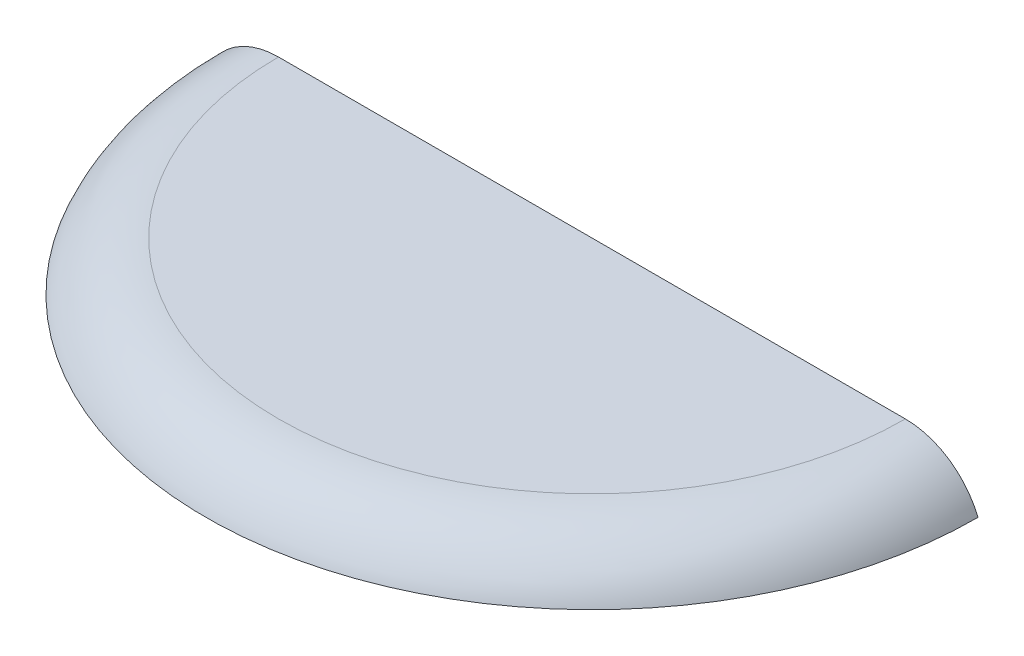
ISO-10303-21;
HEADER;
FILE_DESCRIPTION(('STEP AP214'),'2;1');
FILE_NAME('part.step','',(''),(''),'','','');
FILE_SCHEMA(('AUTOMOTIVE_DESIGN { 1 0 10303 214 1 1 1 1 }'));
ENDSEC;
DATA;
#1=APPLICATION_CONTEXT('core data for automotive mechanical design processes');
#2=APPLICATION_PROTOCOL_DEFINITION('international standard','automotive_design',2000,#1);
#3=PRODUCT_CONTEXT('',#1,'mechanical');
#4=PRODUCT('Part','Part','',(#3));
#5=PRODUCT_RELATED_PRODUCT_CATEGORY('part','',(#4));
#6=PRODUCT_DEFINITION_FORMATION('','',#4);
#7=PRODUCT_DEFINITION_CONTEXT('part definition',#1,'design');
#8=PRODUCT_DEFINITION('design','',#6,#7);
#9=PRODUCT_DEFINITION_SHAPE('','',#8);
#10=(LENGTH_UNIT() NAMED_UNIT(*) SI_UNIT(.MILLI.,.METRE.));
#11=(NAMED_UNIT(*) PLANE_ANGLE_UNIT() SI_UNIT($,.RADIAN.));
#12=(NAMED_UNIT(*) SI_UNIT($,.STERADIAN.) SOLID_ANGLE_UNIT());
#13=UNCERTAINTY_MEASURE_WITH_UNIT(LENGTH_MEASURE(1.E-05),#10,'distance_accuracy_value','');
#14=(GEOMETRIC_REPRESENTATION_CONTEXT(3) GLOBAL_UNCERTAINTY_ASSIGNED_CONTEXT((#13)) GLOBAL_UNIT_ASSIGNED_CONTEXT((#10,
#11,#12)) REPRESENTATION_CONTEXT('',''));
#15=CARTESIAN_POINT('',(0.,0.,0.));
#16=DIRECTION('',(0.,0.,1.));
#17=DIRECTION('',(1.,0.,0.));
#18=AXIS2_PLACEMENT_3D('',#15,#16,#17);
#19=CARTESIAN_POINT('',(0.,58.4278760968653,0.));
#20=DIRECTION('',(0.,1.,0.));
#21=DIRECTION('',(0.,0.,1.));
#22=AXIS2_PLACEMENT_3D('',#19,#20,#21);
#23=PLANE('',#22);
#24=CARTESIAN_POINT('',(0.,58.4278760968653,0.));
#25=DIRECTION('',(0.,1.,0.));
#26=DIRECTION('',(0.,0.,1.));
#27=AXIS2_PLACEMENT_3D('',#24,#25,#26);
#28=CIRCLE('',#27,39.4161984870957);
#29=CARTESIAN_POINT('',(39.4161984870957,58.4278760968653,0.));
#30=VERTEX_POINT('',#29);
#31=CARTESIAN_POINT('',(-39.4161984870957,58.4278760968653,2.77280175019557E-13));
#32=VERTEX_POINT('',#31);
#33=EDGE_CURVE('E12',#30,#32,#28,.F.);
#34=ORIENTED_EDGE('',*,*,#33,.T.);
#35=DIRECTION('',(-1.,0.,0.));
#36=VECTOR('',#35,1.);
#37=CARTESIAN_POINT('',(21.,58.4278760968653,0.));
#38=LINE('',#37,#36);
#39=EDGE_CURVE('E70',#30,#32,#38,.T.);
#40=ORIENTED_EDGE('',*,*,#39,.F.);
#41=EDGE_LOOP('',(#34,#40));
#42=FACE_BOUND('',#41,.T.);
#43=ADVANCED_FACE('F62',(#42),#23,.F.);
#44=CARTESIAN_POINT('',(0.,63.4278760968653,0.));
#45=DIRECTION('',(0.,1.,0.));
#46=DIRECTION('',(0.,0.,1.));
#47=AXIS2_PLACEMENT_3D('',#44,#45,#46);
#48=PLANE('',#47);
#49=DIRECTION('',(1.,0.,0.));
#50=VECTOR('',#49,1.);
#51=CARTESIAN_POINT('',(0.,63.4278760968653,0.));
#52=LINE('',#51,#50);
#53=CARTESIAN_POINT('',(-32.,63.4278760968653,2.51386656396706E-13));
#54=VERTEX_POINT('',#53);
#55=CARTESIAN_POINT('',(32.,63.4278760968653,0.));
#56=VERTEX_POINT('',#55);
#57=EDGE_CURVE('E89',#54,#56,#52,.T.);
#58=ORIENTED_EDGE('',*,*,#57,.F.);
#59=CARTESIAN_POINT('',(0.,63.4278760968653,0.));
#60=DIRECTION('',(0.,-1.,0.));
#61=DIRECTION('',(0.,0.,-1.));
#62=AXIS2_PLACEMENT_3D('',#59,#60,#61);
#63=CIRCLE('',#62,32.);
#64=EDGE_CURVE('E92',#56,#54,#63,.T.);
#65=ORIENTED_EDGE('',*,*,#64,.F.);
#66=EDGE_LOOP('',(#58,#65));
#67=FACE_BOUND('',#66,.T.);
#68=ADVANCED_FACE('F90',(#67),#48,.T.);
#69=CARTESIAN_POINT('',(0.,55.4278760968653,0.));
#70=DIRECTION('',(0.,-1.,0.));
#71=DIRECTION('',(0.,0.,-1.));
#72=AXIS2_PLACEMENT_3D('',#69,#70,#71);
#73=TOROIDAL_SURFACE('',#72,32.,8.);
#74=ORIENTED_EDGE('',*,*,#33,.F.);
#75=CARTESIAN_POINT('',(32.,55.4278760968653,-1.1172740284298E-13));
#76=DIRECTION('',(0.,0.,1.));
#77=DIRECTION('',(1.,0.,0.));
#78=AXIS2_PLACEMENT_3D('',#75,#76,#77);
#79=CIRCLE('',#78,8.);
#80=EDGE_CURVE('E98',#56,#30,#79,.F.);
#81=ORIENTED_EDGE('',*,*,#80,.F.);
#82=ORIENTED_EDGE('',*,*,#64,.T.);
#83=CARTESIAN_POINT('',(-32.,55.4278760968653,1.1172740284298E-13));
#84=DIRECTION('',(0.,0.,1.));
#85=DIRECTION('',(1.,0.,0.));
#86=AXIS2_PLACEMENT_3D('',#83,#84,#85);
#87=CIRCLE('',#86,8.);
#88=EDGE_CURVE('E95',#32,#54,#87,.F.);
#89=ORIENTED_EDGE('',*,*,#88,.F.);
#90=EDGE_LOOP('',(#74,#81,#82,#89));
#91=FACE_BOUND('',#90,.T.);
#92=ADVANCED_FACE('F100',(#91),#73,.T.);
#93=CARTESIAN_POINT('',(21.,73.,0.));
#94=DIRECTION('',(0.,0.,1.));
#95=DIRECTION('',(1.,0.,0.));
#96=AXIS2_PLACEMENT_3D('',#93,#94,#95);
#97=PLANE('',#96);
#98=ORIENTED_EDGE('',*,*,#80,.T.);
#99=ORIENTED_EDGE('',*,*,#39,.T.);
#100=ORIENTED_EDGE('',*,*,#88,.T.);
#101=ORIENTED_EDGE('',*,*,#57,.T.);
#102=EDGE_LOOP('',(#98,#99,#100,#101));
#103=FACE_BOUND('',#102,.T.);
#104=ADVANCED_FACE('F96',(#103),#97,.F.);
#105=CLOSED_SHELL('',(#43,#68,#92,#104));
#106=MANIFOLD_SOLID_BREP('B2',#105);
#107=ADVANCED_BREP_SHAPE_REPRESENTATION('',(#18,#106),#14);
#108=SHAPE_DEFINITION_REPRESENTATION(#9,#107);
ENDSEC;
END-ISO-10303-21;
